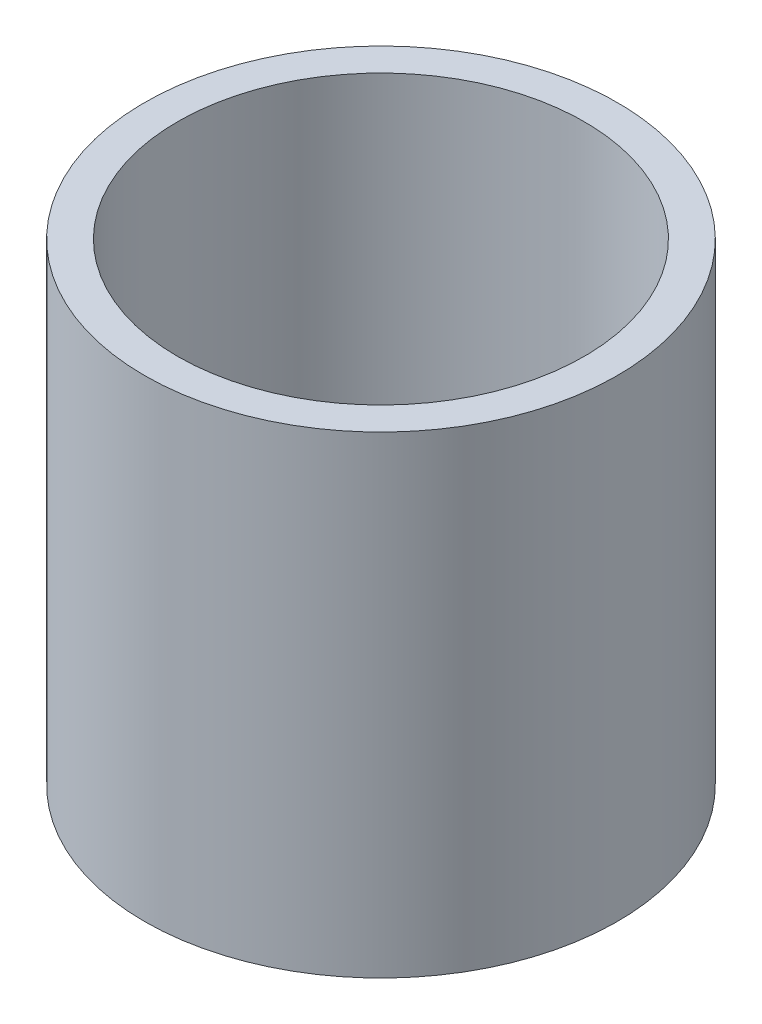
ISO-10303-21;
HEADER;
FILE_DESCRIPTION(('STEP AP214'),'2;1');
FILE_NAME('part.step','',(''),(''),'','','');
FILE_SCHEMA(('AUTOMOTIVE_DESIGN { 1 0 10303 214 1 1 1 1 }'));
ENDSEC;
DATA;
#1=APPLICATION_CONTEXT('core data for automotive mechanical design processes');
#2=APPLICATION_PROTOCOL_DEFINITION('international standard','automotive_design',2000,#1);
#3=PRODUCT_CONTEXT('',#1,'mechanical');
#4=PRODUCT('Part','Part','',(#3));
#5=PRODUCT_RELATED_PRODUCT_CATEGORY('part','',(#4));
#6=PRODUCT_DEFINITION_FORMATION('','',#4);
#7=PRODUCT_DEFINITION_CONTEXT('part definition',#1,'design');
#8=PRODUCT_DEFINITION('design','',#6,#7);
#9=PRODUCT_DEFINITION_SHAPE('','',#8);
#10=(LENGTH_UNIT() NAMED_UNIT(*) SI_UNIT(.MILLI.,.METRE.));
#11=(NAMED_UNIT(*) PLANE_ANGLE_UNIT() SI_UNIT($,.RADIAN.));
#12=(NAMED_UNIT(*) SI_UNIT($,.STERADIAN.) SOLID_ANGLE_UNIT());
#13=UNCERTAINTY_MEASURE_WITH_UNIT(LENGTH_MEASURE(1.E-05),#10,'distance_accuracy_value','');
#14=(GEOMETRIC_REPRESENTATION_CONTEXT(3) GLOBAL_UNCERTAINTY_ASSIGNED_CONTEXT((#13)) GLOBAL_UNIT_ASSIGNED_CONTEXT((#10,
#11,#12)) REPRESENTATION_CONTEXT('',''));
#15=CARTESIAN_POINT('',(0.,0.,0.));
#16=DIRECTION('',(0.,0.,1.));
#17=DIRECTION('',(1.,0.,0.));
#18=AXIS2_PLACEMENT_3D('',#15,#16,#17);
#19=CARTESIAN_POINT('',(0.,100.,0.));
#20=DIRECTION('',(0.,-1.,0.));
#21=DIRECTION('',(0.,0.,-1.));
#22=AXIS2_PLACEMENT_3D('',#19,#20,#21);
#23=CYLINDRICAL_SURFACE('',#22,50.);
#24=CARTESIAN_POINT('',(0.,100.,0.));
#25=DIRECTION('',(0.,1.,0.));
#26=DIRECTION('',(0.,0.,1.));
#27=AXIS2_PLACEMENT_3D('',#24,#25,#26);
#28=CIRCLE('',#27,50.);
#29=CARTESIAN_POINT('',(0.,100.,50.));
#30=VERTEX_POINT('',#29);
#31=EDGE_CURVE('E10',#30,#30,#28,.T.);
#32=ORIENTED_EDGE('',*,*,#31,.F.);
#33=EDGE_LOOP('',(#32));
#34=FACE_BOUND('',#33,.T.);
#35=CARTESIAN_POINT('',(0.,0.,0.));
#36=DIRECTION('',(0.,1.,0.));
#37=DIRECTION('',(0.,0.,1.));
#38=AXIS2_PLACEMENT_3D('',#35,#36,#37);
#39=CIRCLE('',#38,50.);
#40=CARTESIAN_POINT('',(0.,0.,50.));
#41=VERTEX_POINT('',#40);
#42=EDGE_CURVE('E38',#41,#41,#39,.T.);
#43=ORIENTED_EDGE('',*,*,#42,.T.);
#44=EDGE_LOOP('',(#43));
#45=FACE_BOUND('',#44,.T.);
#46=ADVANCED_FACE('F35',(#34,#45),#23,.T.);
#47=CARTESIAN_POINT('',(0.,100.,0.));
#48=DIRECTION('',(0.,1.,0.));
#49=DIRECTION('',(0.,0.,1.));
#50=AXIS2_PLACEMENT_3D('',#47,#48,#49);
#51=PLANE('',#50);
#52=CARTESIAN_POINT('',(0.,100.,0.));
#53=DIRECTION('',(0.,1.,0.));
#54=DIRECTION('',(0.,0.,1.));
#55=AXIS2_PLACEMENT_3D('',#52,#53,#54);
#56=CIRCLE('',#55,43.);
#57=CARTESIAN_POINT('',(0.,100.,43.));
#58=VERTEX_POINT('',#57);
#59=EDGE_CURVE('E47',#58,#58,#56,.T.);
#60=ORIENTED_EDGE('',*,*,#59,.F.);
#61=EDGE_LOOP('',(#60));
#62=FACE_BOUND('',#61,.T.);
#63=ORIENTED_EDGE('',*,*,#31,.T.);
#64=EDGE_LOOP('',(#63));
#65=FACE_BOUND('',#64,.T.);
#66=ADVANCED_FACE('F62',(#62,#65),#51,.T.);
#67=CARTESIAN_POINT('',(0.,0.,0.));
#68=DIRECTION('',(0.,1.,0.));
#69=DIRECTION('',(0.,0.,1.));
#70=AXIS2_PLACEMENT_3D('',#67,#68,#69);
#71=PLANE('',#70);
#72=CARTESIAN_POINT('',(0.,0.,0.));
#73=DIRECTION('',(0.,1.,0.));
#74=DIRECTION('',(0.,0.,1.));
#75=AXIS2_PLACEMENT_3D('',#72,#73,#74);
#76=CIRCLE('',#75,43.);
#77=CARTESIAN_POINT('',(0.,0.,43.));
#78=VERTEX_POINT('',#77);
#79=EDGE_CURVE('E45',#78,#78,#76,.T.);
#80=ORIENTED_EDGE('',*,*,#79,.T.);
#81=EDGE_LOOP('',(#80));
#82=FACE_BOUND('',#81,.T.);
#83=ORIENTED_EDGE('',*,*,#42,.F.);
#84=EDGE_LOOP('',(#83));
#85=FACE_BOUND('',#84,.T.);
#86=ADVANCED_FACE('F53',(#82,#85),#71,.F.);
#87=CARTESIAN_POINT('',(0.,0.,0.));
#88=DIRECTION('',(0.,1.,0.));
#89=DIRECTION('',(0.,0.,1.));
#90=AXIS2_PLACEMENT_3D('',#87,#88,#89);
#91=CYLINDRICAL_SURFACE('',#90,43.);
#92=ORIENTED_EDGE('',*,*,#79,.F.);
#93=EDGE_LOOP('',(#92));
#94=FACE_BOUND('',#93,.T.);
#95=ORIENTED_EDGE('',*,*,#59,.T.);
#96=EDGE_LOOP('',(#95));
#97=FACE_BOUND('',#96,.T.);
#98=ADVANCED_FACE('F56',(#94,#97),#91,.F.);
#99=CLOSED_SHELL('',(#46,#66,#86,#98));
#100=MANIFOLD_SOLID_BREP('B2',#99);
#101=ADVANCED_BREP_SHAPE_REPRESENTATION('',(#18,#100),#14);
#102=SHAPE_DEFINITION_REPRESENTATION(#9,#101);
ENDSEC;
END-ISO-10303-21;
